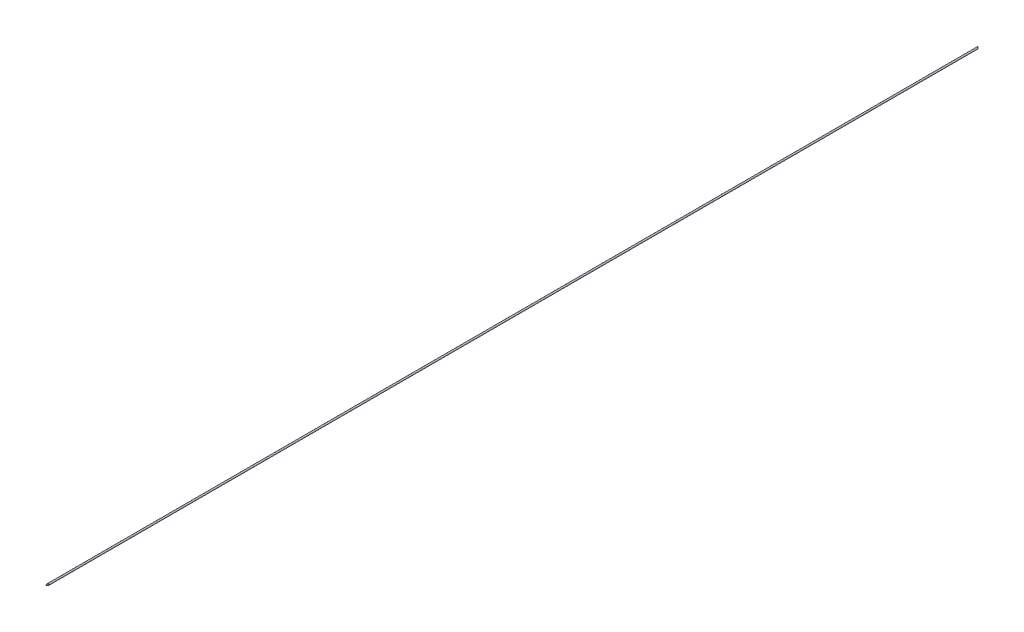
ISO-10303-21;
HEADER;
FILE_DESCRIPTION(('STEP AP214'),'2;1');
FILE_NAME('part.step','',(''),(''),'','','');
FILE_SCHEMA(('AUTOMOTIVE_DESIGN { 1 0 10303 214 1 1 1 1 }'));
ENDSEC;
DATA;
#1=APPLICATION_CONTEXT('core data for automotive mechanical design processes');
#2=APPLICATION_PROTOCOL_DEFINITION('international standard','automotive_design',2000,#1);
#3=PRODUCT_CONTEXT('',#1,'mechanical');
#4=PRODUCT('Part','Part','',(#3));
#5=PRODUCT_RELATED_PRODUCT_CATEGORY('part','',(#4));
#6=PRODUCT_DEFINITION_FORMATION('','',#4);
#7=PRODUCT_DEFINITION_CONTEXT('part definition',#1,'design');
#8=PRODUCT_DEFINITION('design','',#6,#7);
#9=PRODUCT_DEFINITION_SHAPE('','',#8);
#10=(LENGTH_UNIT() NAMED_UNIT(*) SI_UNIT(.MILLI.,.METRE.));
#11=(NAMED_UNIT(*) PLANE_ANGLE_UNIT() SI_UNIT($,.RADIAN.));
#12=(NAMED_UNIT(*) SI_UNIT($,.STERADIAN.) SOLID_ANGLE_UNIT());
#13=UNCERTAINTY_MEASURE_WITH_UNIT(LENGTH_MEASURE(1.E-05),#10,'distance_accuracy_value','');
#14=(GEOMETRIC_REPRESENTATION_CONTEXT(3) GLOBAL_UNCERTAINTY_ASSIGNED_CONTEXT((#13)) GLOBAL_UNIT_ASSIGNED_CONTEXT((#10,
#11,#12)) REPRESENTATION_CONTEXT('',''));
#15=CARTESIAN_POINT('',(0.,0.,0.));
#16=DIRECTION('',(0.,0.,1.));
#17=DIRECTION('',(1.,0.,0.));
#18=AXIS2_PLACEMENT_3D('',#15,#16,#17);
#19=CARTESIAN_POINT('',(0.,0.,2920.));
#20=DIRECTION('',(0.,0.,-1.));
#21=DIRECTION('',(-1.,0.,0.));
#22=AXIS2_PLACEMENT_3D('',#19,#20,#21);
#23=CYLINDRICAL_SURFACE('',#22,4.99999999999989);
#24=CARTESIAN_POINT('',(0.,0.,2915.));
#25=DIRECTION('',(-0.707106781186548,0.,-0.707106781186548));
#26=DIRECTION('',(0.707106781186548,0.,-0.707106781186548));
#27=AXIS2_PLACEMENT_3D('',#24,#25,#26);
#28=ELLIPSE('',#27,7.07106781186533,4.99999999999989);
#29=CARTESIAN_POINT('',(4.99999999999989,0.,2910.));
#30=VERTEX_POINT('',#29);
#31=EDGE_CURVE('E10',#30,#30,#28,.T.);
#32=ORIENTED_EDGE('',*,*,#31,.T.);
#33=EDGE_LOOP('',(#32));
#34=FACE_BOUND('',#33,.T.);
#35=CARTESIAN_POINT('',(0.,0.,-2915.));
#36=DIRECTION('',(0.707106781186548,0.,-0.707106781186548));
#37=DIRECTION('',(-0.707106781186548,0.,-0.707106781186548));
#38=AXIS2_PLACEMENT_3D('',#35,#36,#37);
#39=ELLIPSE('',#38,7.07106781186533,4.99999999999989);
#40=CARTESIAN_POINT('',(-4.99999999999989,0.,-2920.));
#41=VERTEX_POINT('',#40);
#42=EDGE_CURVE('E43',#41,#41,#39,.T.);
#43=ORIENTED_EDGE('',*,*,#42,.F.);
#44=EDGE_LOOP('',(#43));
#45=FACE_BOUND('',#44,.T.);
#46=ADVANCED_FACE('F37',(#34,#45),#23,.T.);
#47=CARTESIAN_POINT('',(-4.99999999999989,-5.,2920.));
#48=DIRECTION('',(-0.707106781186548,0.,-0.707106781186548));
#49=DIRECTION('',(-0.707106781186548,0.,0.707106781186548));
#50=AXIS2_PLACEMENT_3D('',#47,#48,#49);
#51=PLANE('',#50);
#52=ORIENTED_EDGE('',*,*,#31,.F.);
#53=EDGE_LOOP('',(#52));
#54=FACE_BOUND('',#53,.T.);
#55=ADVANCED_FACE('F52',(#54),#51,.F.);
#56=CARTESIAN_POINT('',(-4.99999999999989,-5.,-2920.));
#57=DIRECTION('',(0.707106781186548,0.,-0.707106781186548));
#58=DIRECTION('',(-0.707106781186548,0.,-0.707106781186548));
#59=AXIS2_PLACEMENT_3D('',#56,#57,#58);
#60=PLANE('',#59);
#61=ORIENTED_EDGE('',*,*,#42,.T.);
#62=EDGE_LOOP('',(#61));
#63=FACE_BOUND('',#62,.T.);
#64=ADVANCED_FACE('F49',(#63),#60,.T.);
#65=CLOSED_SHELL('',(#46,#55,#64));
#66=MANIFOLD_SOLID_BREP('B2',#65);
#67=ADVANCED_BREP_SHAPE_REPRESENTATION('',(#18,#66),#14);
#68=SHAPE_DEFINITION_REPRESENTATION(#9,#67);
ENDSEC;
END-ISO-10303-21;
